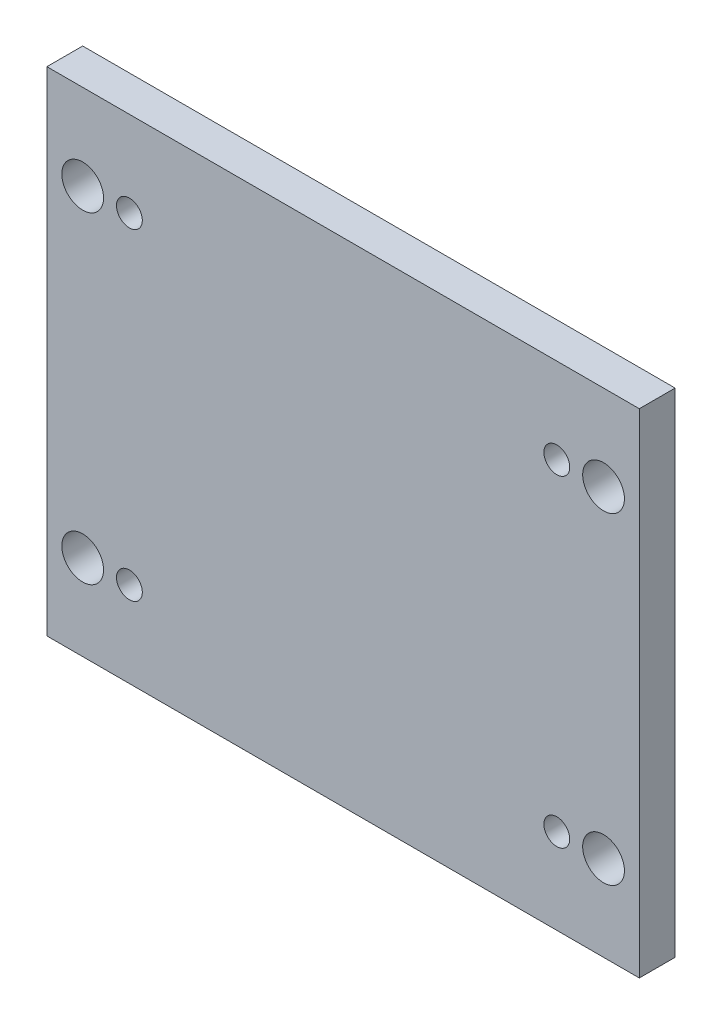
ISO-10303-21;
HEADER;
FILE_DESCRIPTION(('STEP AP214'),'2;1');
FILE_NAME('part.step','',(''),(''),'','','');
FILE_SCHEMA(('AUTOMOTIVE_DESIGN { 1 0 10303 214 1 1 1 1 }'));
ENDSEC;
DATA;
#1=APPLICATION_CONTEXT('core data for automotive mechanical design processes');
#2=APPLICATION_PROTOCOL_DEFINITION('international standard','automotive_design',2000,#1);
#3=PRODUCT_CONTEXT('',#1,'mechanical');
#4=PRODUCT('Part','Part','',(#3));
#5=PRODUCT_RELATED_PRODUCT_CATEGORY('part','',(#4));
#6=PRODUCT_DEFINITION_FORMATION('','',#4);
#7=PRODUCT_DEFINITION_CONTEXT('part definition',#1,'design');
#8=PRODUCT_DEFINITION('design','',#6,#7);
#9=PRODUCT_DEFINITION_SHAPE('','',#8);
#10=(LENGTH_UNIT() NAMED_UNIT(*) SI_UNIT(.MILLI.,.METRE.));
#11=(NAMED_UNIT(*) PLANE_ANGLE_UNIT() SI_UNIT($,.RADIAN.));
#12=(NAMED_UNIT(*) SI_UNIT($,.STERADIAN.) SOLID_ANGLE_UNIT());
#13=UNCERTAINTY_MEASURE_WITH_UNIT(LENGTH_MEASURE(1.E-05),#10,'distance_accuracy_value','');
#14=(GEOMETRIC_REPRESENTATION_CONTEXT(3) GLOBAL_UNCERTAINTY_ASSIGNED_CONTEXT((#13)) GLOBAL_UNIT_ASSIGNED_CONTEXT((#10,
#11,#12)) REPRESENTATION_CONTEXT('',''));
#15=CARTESIAN_POINT('',(0.,0.,0.));
#16=DIRECTION('',(0.,0.,1.));
#17=DIRECTION('',(1.,0.,0.));
#18=AXIS2_PLACEMENT_3D('',#15,#16,#17);
#19=CARTESIAN_POINT('',(0.,0.,36.));
#20=DIRECTION('',(0.,0.,1.));
#21=DIRECTION('',(1.,0.,0.));
#22=AXIS2_PLACEMENT_3D('',#19,#20,#21);
#23=PLANE('',#22);
#24=CARTESIAN_POINT('',(-215.,-162.,36.));
#25=DIRECTION('',(0.,0.,-1.));
#26=DIRECTION('',(-1.,0.,0.));
#27=AXIS2_PLACEMENT_3D('',#24,#25,#26);
#28=CIRCLE('',#27,13.);
#29=CARTESIAN_POINT('',(-228.,-162.,36.));
#30=VERTEX_POINT('',#29);
#31=EDGE_CURVE('E173',#30,#30,#28,.T.);
#32=ORIENTED_EDGE('',*,*,#31,.T.);
#33=EDGE_LOOP('',(#32));
#34=FACE_BOUND('',#33,.T.);
#35=CARTESIAN_POINT('',(215.,162.,36.));
#36=DIRECTION('',(0.,0.,1.));
#37=DIRECTION('',(1.,0.,0.));
#38=AXIS2_PLACEMENT_3D('',#35,#36,#37);
#39=CIRCLE('',#38,13.);
#40=CARTESIAN_POINT('',(228.,162.,36.));
#41=VERTEX_POINT('',#40);
#42=EDGE_CURVE('E152',#41,#41,#39,.T.);
#43=ORIENTED_EDGE('',*,*,#42,.F.);
#44=EDGE_LOOP('',(#43));
#45=FACE_BOUND('',#44,.T.);
#46=CARTESIAN_POINT('',(-262.,162.,36.));
#47=DIRECTION('',(0.,0.,1.));
#48=DIRECTION('',(1.,0.,0.));
#49=AXIS2_PLACEMENT_3D('',#46,#47,#48);
#50=CIRCLE('',#49,21.);
#51=CARTESIAN_POINT('',(-241.,162.,36.));
#52=VERTEX_POINT('',#51);
#53=EDGE_CURVE('E132',#52,#52,#50,.T.);
#54=ORIENTED_EDGE('',*,*,#53,.F.);
#55=EDGE_LOOP('',(#54));
#56=FACE_BOUND('',#55,.T.);
#57=CARTESIAN_POINT('',(-262.,-162.,36.));
#58=DIRECTION('',(0.,0.,1.));
#59=DIRECTION('',(1.,0.,0.));
#60=AXIS2_PLACEMENT_3D('',#57,#58,#59);
#61=CIRCLE('',#60,21.);
#62=CARTESIAN_POINT('',(-241.,-162.,36.));
#63=VERTEX_POINT('',#62);
#64=EDGE_CURVE('E126',#63,#63,#61,.T.);
#65=ORIENTED_EDGE('',*,*,#64,.F.);
#66=EDGE_LOOP('',(#65));
#67=FACE_BOUND('',#66,.T.);
#68=CARTESIAN_POINT('',(262.,-162.,36.));
#69=DIRECTION('',(0.,0.,1.));
#70=DIRECTION('',(1.,0.,0.));
#71=AXIS2_PLACEMENT_3D('',#68,#69,#70);
#72=CIRCLE('',#71,21.);
#73=CARTESIAN_POINT('',(283.,-162.,36.));
#74=VERTEX_POINT('',#73);
#75=EDGE_CURVE('E120',#74,#74,#72,.T.);
#76=ORIENTED_EDGE('',*,*,#75,.F.);
#77=EDGE_LOOP('',(#76));
#78=FACE_BOUND('',#77,.T.);
#79=CARTESIAN_POINT('',(262.,162.,36.));
#80=DIRECTION('',(0.,0.,1.));
#81=DIRECTION('',(1.,0.,0.));
#82=AXIS2_PLACEMENT_3D('',#79,#80,#81);
#83=CIRCLE('',#82,21.);
#84=CARTESIAN_POINT('',(283.,162.,36.));
#85=VERTEX_POINT('',#84);
#86=EDGE_CURVE('E114',#85,#85,#83,.T.);
#87=ORIENTED_EDGE('',*,*,#86,.F.);
#88=EDGE_LOOP('',(#87));
#89=FACE_BOUND('',#88,.T.);
#90=DIRECTION('',(0.,-1.,0.));
#91=VECTOR('',#90,1.);
#92=CARTESIAN_POINT('',(-298.,248.,36.));
#93=LINE('',#92,#91);
#94=CARTESIAN_POINT('',(-298.,248.,36.));
#95=VERTEX_POINT('',#94);
#96=CARTESIAN_POINT('',(-298.,-248.,36.));
#97=VERTEX_POINT('',#96);
#98=EDGE_CURVE('E87',#95,#97,#93,.T.);
#99=ORIENTED_EDGE('',*,*,#98,.T.);
#100=DIRECTION('',(1.,0.,0.));
#101=VECTOR('',#100,1.);
#102=CARTESIAN_POINT('',(-298.,-248.,36.));
#103=LINE('',#102,#101);
#104=CARTESIAN_POINT('',(298.,-248.,36.));
#105=VERTEX_POINT('',#104);
#106=EDGE_CURVE('E82',#97,#105,#103,.T.);
#107=ORIENTED_EDGE('',*,*,#106,.T.);
#108=DIRECTION('',(0.,1.,0.));
#109=VECTOR('',#108,1.);
#110=CARTESIAN_POINT('',(298.,-248.,36.));
#111=LINE('',#110,#109);
#112=CARTESIAN_POINT('',(298.,248.,36.));
#113=VERTEX_POINT('',#112);
#114=EDGE_CURVE('E85',#105,#113,#111,.T.);
#115=ORIENTED_EDGE('',*,*,#114,.T.);
#116=DIRECTION('',(-1.,0.,0.));
#117=VECTOR('',#116,1.);
#118=CARTESIAN_POINT('',(298.,248.,36.));
#119=LINE('',#118,#117);
#120=EDGE_CURVE('E52',#113,#95,#119,.T.);
#121=ORIENTED_EDGE('',*,*,#120,.T.);
#122=EDGE_LOOP('',(#99,#107,#115,#121));
#123=FACE_BOUND('',#122,.T.);
#124=CARTESIAN_POINT('',(215.,-162.,36.));
#125=DIRECTION('',(0.,0.,-1.));
#126=DIRECTION('',(-1.,0.,0.));
#127=AXIS2_PLACEMENT_3D('',#124,#125,#126);
#128=CIRCLE('',#127,13.);
#129=CARTESIAN_POINT('',(202.,-162.,36.));
#130=VERTEX_POINT('',#129);
#131=EDGE_CURVE('E164',#130,#130,#128,.T.);
#132=ORIENTED_EDGE('',*,*,#131,.T.);
#133=EDGE_LOOP('',(#132));
#134=FACE_BOUND('',#133,.T.);
#135=CARTESIAN_POINT('',(-215.,162.,36.));
#136=DIRECTION('',(0.,0.,1.));
#137=DIRECTION('',(1.,0.,0.));
#138=AXIS2_PLACEMENT_3D('',#135,#136,#137);
#139=CIRCLE('',#138,13.);
#140=CARTESIAN_POINT('',(-202.,162.,36.));
#141=VERTEX_POINT('',#140);
#142=EDGE_CURVE('E179',#141,#141,#139,.T.);
#143=ORIENTED_EDGE('',*,*,#142,.F.);
#144=EDGE_LOOP('',(#143));
#145=FACE_BOUND('',#144,.T.);
#146=ADVANCED_FACE('F35',(#34,#45,#56,#67,#78,#89,#123,#134,#145),#23,.T.);
#147=CARTESIAN_POINT('',(0.,0.,0.));
#148=DIRECTION('',(0.,0.,1.));
#149=DIRECTION('',(1.,0.,0.));
#150=AXIS2_PLACEMENT_3D('',#147,#148,#149);
#151=PLANE('',#150);
#152=CARTESIAN_POINT('',(-215.,162.,0.));
#153=DIRECTION('',(0.,0.,1.));
#154=DIRECTION('',(1.,0.,0.));
#155=AXIS2_PLACEMENT_3D('',#152,#153,#154);
#156=CIRCLE('',#155,9.00000000000001);
#157=CARTESIAN_POINT('',(-206.,162.,0.));
#158=VERTEX_POINT('',#157);
#159=EDGE_CURVE('E143',#158,#158,#156,.T.);
#160=ORIENTED_EDGE('',*,*,#159,.T.);
#161=EDGE_LOOP('',(#160));
#162=FACE_BOUND('',#161,.T.);
#163=CARTESIAN_POINT('',(215.,162.,0.));
#164=DIRECTION('',(0.,0.,1.));
#165=DIRECTION('',(1.,0.,0.));
#166=AXIS2_PLACEMENT_3D('',#163,#164,#165);
#167=CIRCLE('',#166,9.00000000000001);
#168=CARTESIAN_POINT('',(224.,162.,0.));
#169=VERTEX_POINT('',#168);
#170=EDGE_CURVE('E135',#169,#169,#167,.T.);
#171=ORIENTED_EDGE('',*,*,#170,.T.);
#172=EDGE_LOOP('',(#171));
#173=FACE_BOUND('',#172,.T.);
#174=CARTESIAN_POINT('',(-262.,162.,0.));
#175=DIRECTION('',(0.,0.,1.));
#176=DIRECTION('',(1.,0.,0.));
#177=AXIS2_PLACEMENT_3D('',#174,#175,#176);
#178=CIRCLE('',#177,21.);
#179=CARTESIAN_POINT('',(-241.,162.,0.));
#180=VERTEX_POINT('',#179);
#181=EDGE_CURVE('E129',#180,#180,#178,.T.);
#182=ORIENTED_EDGE('',*,*,#181,.T.);
#183=EDGE_LOOP('',(#182));
#184=FACE_BOUND('',#183,.T.);
#185=CARTESIAN_POINT('',(-262.,-162.,0.));
#186=DIRECTION('',(0.,0.,1.));
#187=DIRECTION('',(1.,0.,0.));
#188=AXIS2_PLACEMENT_3D('',#185,#186,#187);
#189=CIRCLE('',#188,21.);
#190=CARTESIAN_POINT('',(-241.,-162.,0.));
#191=VERTEX_POINT('',#190);
#192=EDGE_CURVE('E123',#191,#191,#189,.T.);
#193=ORIENTED_EDGE('',*,*,#192,.T.);
#194=EDGE_LOOP('',(#193));
#195=FACE_BOUND('',#194,.T.);
#196=CARTESIAN_POINT('',(262.,-162.,0.));
#197=DIRECTION('',(0.,0.,1.));
#198=DIRECTION('',(1.,0.,0.));
#199=AXIS2_PLACEMENT_3D('',#196,#197,#198);
#200=CIRCLE('',#199,21.);
#201=CARTESIAN_POINT('',(283.,-162.,0.));
#202=VERTEX_POINT('',#201);
#203=EDGE_CURVE('E117',#202,#202,#200,.T.);
#204=ORIENTED_EDGE('',*,*,#203,.T.);
#205=EDGE_LOOP('',(#204));
#206=FACE_BOUND('',#205,.T.);
#207=CARTESIAN_POINT('',(262.,162.,0.));
#208=DIRECTION('',(0.,0.,1.));
#209=DIRECTION('',(1.,0.,0.));
#210=AXIS2_PLACEMENT_3D('',#207,#208,#209);
#211=CIRCLE('',#210,21.);
#212=CARTESIAN_POINT('',(283.,162.,0.));
#213=VERTEX_POINT('',#212);
#214=EDGE_CURVE('E102',#213,#213,#211,.T.);
#215=ORIENTED_EDGE('',*,*,#214,.T.);
#216=EDGE_LOOP('',(#215));
#217=FACE_BOUND('',#216,.T.);
#218=DIRECTION('',(0.,-1.,0.));
#219=VECTOR('',#218,1.);
#220=CARTESIAN_POINT('',(-298.,248.,0.));
#221=LINE('',#220,#219);
#222=CARTESIAN_POINT('',(-298.,248.,0.));
#223=VERTEX_POINT('',#222);
#224=CARTESIAN_POINT('',(-298.,-248.,0.));
#225=VERTEX_POINT('',#224);
#226=EDGE_CURVE('E99',#223,#225,#221,.T.);
#227=ORIENTED_EDGE('',*,*,#226,.F.);
#228=DIRECTION('',(-1.,0.,0.));
#229=VECTOR('',#228,1.);
#230=CARTESIAN_POINT('',(298.,248.,0.));
#231=LINE('',#230,#229);
#232=CARTESIAN_POINT('',(298.,248.,0.));
#233=VERTEX_POINT('',#232);
#234=EDGE_CURVE('E75',#233,#223,#231,.T.);
#235=ORIENTED_EDGE('',*,*,#234,.F.);
#236=DIRECTION('',(0.,1.,0.));
#237=VECTOR('',#236,1.);
#238=CARTESIAN_POINT('',(298.,-248.,0.));
#239=LINE('',#238,#237);
#240=CARTESIAN_POINT('',(298.,-248.,0.));
#241=VERTEX_POINT('',#240);
#242=EDGE_CURVE('E69',#241,#233,#239,.T.);
#243=ORIENTED_EDGE('',*,*,#242,.F.);
#244=DIRECTION('',(1.,0.,0.));
#245=VECTOR('',#244,1.);
#246=CARTESIAN_POINT('',(-298.,-248.,0.));
#247=LINE('',#246,#245);
#248=EDGE_CURVE('E91',#225,#241,#247,.T.);
#249=ORIENTED_EDGE('',*,*,#248,.F.);
#250=EDGE_LOOP('',(#227,#235,#243,#249));
#251=FACE_BOUND('',#250,.T.);
#252=CARTESIAN_POINT('',(215.,-162.,0.));
#253=DIRECTION('',(0.,0.,-1.));
#254=DIRECTION('',(-1.,0.,0.));
#255=AXIS2_PLACEMENT_3D('',#252,#253,#254);
#256=CIRCLE('',#255,9.00000000000001);
#257=CARTESIAN_POINT('',(206.,-162.,0.));
#258=VERTEX_POINT('',#257);
#259=EDGE_CURVE('E140',#258,#258,#256,.T.);
#260=ORIENTED_EDGE('',*,*,#259,.F.);
#261=EDGE_LOOP('',(#260));
#262=FACE_BOUND('',#261,.T.);
#263=CARTESIAN_POINT('',(-215.,-162.,0.));
#264=DIRECTION('',(0.,0.,-1.));
#265=DIRECTION('',(-1.,0.,0.));
#266=AXIS2_PLACEMENT_3D('',#263,#264,#265);
#267=CIRCLE('',#266,9.00000000000001);
#268=CARTESIAN_POINT('',(-224.,-162.,0.));
#269=VERTEX_POINT('',#268);
#270=EDGE_CURVE('E146',#269,#269,#267,.T.);
#271=ORIENTED_EDGE('',*,*,#270,.F.);
#272=EDGE_LOOP('',(#271));
#273=FACE_BOUND('',#272,.T.);
#274=ADVANCED_FACE('F110',(#162,#173,#184,#195,#206,#217,#251,#262,#273),#151,.F.);
#275=CARTESIAN_POINT('',(-298.,248.,36.));
#276=DIRECTION('',(1.,0.,0.));
#277=DIRECTION('',(0.,0.,-1.));
#278=AXIS2_PLACEMENT_3D('',#275,#276,#277);
#279=PLANE('',#278);
#280=ORIENTED_EDGE('',*,*,#226,.T.);
#281=DIRECTION('',(0.,0.,-1.));
#282=VECTOR('',#281,1.);
#283=CARTESIAN_POINT('',(-298.,-248.,36.));
#284=LINE('',#283,#282);
#285=EDGE_CURVE('E11',#97,#225,#284,.T.);
#286=ORIENTED_EDGE('',*,*,#285,.F.);
#287=ORIENTED_EDGE('',*,*,#98,.F.);
#288=DIRECTION('',(0.,0.,-1.));
#289=VECTOR('',#288,1.);
#290=CARTESIAN_POINT('',(-298.,248.,36.));
#291=LINE('',#290,#289);
#292=EDGE_CURVE('E95',#95,#223,#291,.T.);
#293=ORIENTED_EDGE('',*,*,#292,.T.);
#294=EDGE_LOOP('',(#280,#286,#287,#293));
#295=FACE_BOUND('',#294,.T.);
#296=ADVANCED_FACE('F37',(#295),#279,.F.);
#297=CARTESIAN_POINT('',(-298.,-248.,36.));
#298=DIRECTION('',(0.,1.,0.));
#299=DIRECTION('',(0.,0.,1.));
#300=AXIS2_PLACEMENT_3D('',#297,#298,#299);
#301=PLANE('',#300);
#302=ORIENTED_EDGE('',*,*,#248,.T.);
#303=DIRECTION('',(0.,0.,-1.));
#304=VECTOR('',#303,1.);
#305=CARTESIAN_POINT('',(298.,-248.,36.));
#306=LINE('',#305,#304);
#307=EDGE_CURVE('E44',#105,#241,#306,.T.);
#308=ORIENTED_EDGE('',*,*,#307,.F.);
#309=ORIENTED_EDGE('',*,*,#106,.F.);
#310=ORIENTED_EDGE('',*,*,#285,.T.);
#311=EDGE_LOOP('',(#302,#308,#309,#310));
#312=FACE_BOUND('',#311,.T.);
#313=ADVANCED_FACE('F90',(#312),#301,.F.);
#314=CARTESIAN_POINT('',(298.,-248.,36.));
#315=DIRECTION('',(-1.,0.,0.));
#316=DIRECTION('',(0.,0.,1.));
#317=AXIS2_PLACEMENT_3D('',#314,#315,#316);
#318=PLANE('',#317);
#319=ORIENTED_EDGE('',*,*,#242,.T.);
#320=DIRECTION('',(0.,0.,-1.));
#321=VECTOR('',#320,1.);
#322=CARTESIAN_POINT('',(298.,248.,36.));
#323=LINE('',#322,#321);
#324=EDGE_CURVE('E92',#113,#233,#323,.T.);
#325=ORIENTED_EDGE('',*,*,#324,.F.);
#326=ORIENTED_EDGE('',*,*,#114,.F.);
#327=ORIENTED_EDGE('',*,*,#307,.T.);
#328=EDGE_LOOP('',(#319,#325,#326,#327));
#329=FACE_BOUND('',#328,.T.);
#330=ADVANCED_FACE('F93',(#329),#318,.F.);
#331=CARTESIAN_POINT('',(298.,248.,36.));
#332=DIRECTION('',(0.,-1.,0.));
#333=DIRECTION('',(0.,0.,-1.));
#334=AXIS2_PLACEMENT_3D('',#331,#332,#333);
#335=PLANE('',#334);
#336=ORIENTED_EDGE('',*,*,#234,.T.);
#337=ORIENTED_EDGE('',*,*,#292,.F.);
#338=ORIENTED_EDGE('',*,*,#120,.F.);
#339=ORIENTED_EDGE('',*,*,#324,.T.);
#340=EDGE_LOOP('',(#336,#337,#338,#339));
#341=FACE_BOUND('',#340,.T.);
#342=ADVANCED_FACE('F107',(#341),#335,.F.);
#343=CARTESIAN_POINT('',(262.,162.,0.));
#344=DIRECTION('',(0.,0.,1.));
#345=DIRECTION('',(1.,0.,0.));
#346=AXIS2_PLACEMENT_3D('',#343,#344,#345);
#347=CYLINDRICAL_SURFACE('',#346,21.);
#348=ORIENTED_EDGE('',*,*,#214,.F.);
#349=EDGE_LOOP('',(#348));
#350=FACE_BOUND('',#349,.T.);
#351=ORIENTED_EDGE('',*,*,#86,.T.);
#352=EDGE_LOOP('',(#351));
#353=FACE_BOUND('',#352,.T.);
#354=ADVANCED_FACE('F212',(#350,#353),#347,.F.);
#355=CARTESIAN_POINT('',(262.,-162.,0.));
#356=DIRECTION('',(0.,0.,1.));
#357=DIRECTION('',(1.,0.,0.));
#358=AXIS2_PLACEMENT_3D('',#355,#356,#357);
#359=CYLINDRICAL_SURFACE('',#358,21.);
#360=ORIENTED_EDGE('',*,*,#203,.F.);
#361=EDGE_LOOP('',(#360));
#362=FACE_BOUND('',#361,.T.);
#363=ORIENTED_EDGE('',*,*,#75,.T.);
#364=EDGE_LOOP('',(#363));
#365=FACE_BOUND('',#364,.T.);
#366=ADVANCED_FACE('F309',(#362,#365),#359,.F.);
#367=CARTESIAN_POINT('',(-262.,-162.,0.));
#368=DIRECTION('',(0.,0.,1.));
#369=DIRECTION('',(1.,0.,0.));
#370=AXIS2_PLACEMENT_3D('',#367,#368,#369);
#371=CYLINDRICAL_SURFACE('',#370,21.);
#372=ORIENTED_EDGE('',*,*,#192,.F.);
#373=EDGE_LOOP('',(#372));
#374=FACE_BOUND('',#373,.T.);
#375=ORIENTED_EDGE('',*,*,#64,.T.);
#376=EDGE_LOOP('',(#375));
#377=FACE_BOUND('',#376,.T.);
#378=ADVANCED_FACE('F319',(#374,#377),#371,.F.);
#379=CARTESIAN_POINT('',(-262.,162.,0.));
#380=DIRECTION('',(0.,0.,1.));
#381=DIRECTION('',(1.,0.,0.));
#382=AXIS2_PLACEMENT_3D('',#379,#380,#381);
#383=CYLINDRICAL_SURFACE('',#382,21.);
#384=ORIENTED_EDGE('',*,*,#181,.F.);
#385=EDGE_LOOP('',(#384));
#386=FACE_BOUND('',#385,.T.);
#387=ORIENTED_EDGE('',*,*,#53,.T.);
#388=EDGE_LOOP('',(#387));
#389=FACE_BOUND('',#388,.T.);
#390=ADVANCED_FACE('F328',(#386,#389),#383,.F.);
#391=CARTESIAN_POINT('',(215.,162.,0.));
#392=DIRECTION('',(0.,0.,1.));
#393=DIRECTION('',(1.,0.,0.));
#394=AXIS2_PLACEMENT_3D('',#391,#392,#393);
#395=CYLINDRICAL_SURFACE('',#394,9.00000000000001);
#396=CARTESIAN_POINT('',(215.,162.,15.));
#397=DIRECTION('',(0.,0.,1.));
#398=DIRECTION('',(1.,0.,0.));
#399=AXIS2_PLACEMENT_3D('',#396,#397,#398);
#400=CIRCLE('',#399,9.00000000000001);
#401=CARTESIAN_POINT('',(224.,162.,15.));
#402=VERTEX_POINT('',#401);
#403=EDGE_CURVE('E149',#402,#402,#400,.T.);
#404=ORIENTED_EDGE('',*,*,#403,.T.);
#405=EDGE_LOOP('',(#404));
#406=FACE_BOUND('',#405,.T.);
#407=ORIENTED_EDGE('',*,*,#170,.F.);
#408=EDGE_LOOP('',(#407));
#409=FACE_BOUND('',#408,.T.);
#410=ADVANCED_FACE('F338',(#406,#409),#395,.F.);
#411=CARTESIAN_POINT('',(215.,-162.,15.));
#412=DIRECTION('',(0.,0.,-1.));
#413=DIRECTION('',(-1.,0.,0.));
#414=AXIS2_PLACEMENT_3D('',#411,#412,#413);
#415=CYLINDRICAL_SURFACE('',#414,9.00000000000001);
#416=ORIENTED_EDGE('',*,*,#259,.T.);
#417=EDGE_LOOP('',(#416));
#418=FACE_BOUND('',#417,.T.);
#419=CARTESIAN_POINT('',(215.,-162.,15.));
#420=DIRECTION('',(0.,0.,1.));
#421=DIRECTION('',(1.,0.,0.));
#422=AXIS2_PLACEMENT_3D('',#419,#420,#421);
#423=CIRCLE('',#422,9.00000000000001);
#424=CARTESIAN_POINT('',(224.,-162.,15.));
#425=VERTEX_POINT('',#424);
#426=EDGE_CURVE('E158',#425,#425,#423,.T.);
#427=ORIENTED_EDGE('',*,*,#426,.T.);
#428=EDGE_LOOP('',(#427));
#429=FACE_BOUND('',#428,.T.);
#430=ADVANCED_FACE('F348',(#418,#429),#415,.F.);
#431=CARTESIAN_POINT('',(-215.,162.,0.));
#432=DIRECTION('',(0.,0.,1.));
#433=DIRECTION('',(1.,0.,0.));
#434=AXIS2_PLACEMENT_3D('',#431,#432,#433);
#435=CYLINDRICAL_SURFACE('',#434,9.00000000000001);
#436=CARTESIAN_POINT('',(-215.,162.,15.));
#437=DIRECTION('',(0.,0.,1.));
#438=DIRECTION('',(1.,0.,0.));
#439=AXIS2_PLACEMENT_3D('',#436,#437,#438);
#440=CIRCLE('',#439,9.00000000000001);
#441=CARTESIAN_POINT('',(-206.,162.,15.));
#442=VERTEX_POINT('',#441);
#443=EDGE_CURVE('E176',#442,#442,#440,.T.);
#444=ORIENTED_EDGE('',*,*,#443,.T.);
#445=EDGE_LOOP('',(#444));
#446=FACE_BOUND('',#445,.T.);
#447=ORIENTED_EDGE('',*,*,#159,.F.);
#448=EDGE_LOOP('',(#447));
#449=FACE_BOUND('',#448,.T.);
#450=ADVANCED_FACE('F237',(#446,#449),#435,.F.);
#451=CARTESIAN_POINT('',(-215.,-162.,15.));
#452=DIRECTION('',(0.,0.,-1.));
#453=DIRECTION('',(-1.,0.,0.));
#454=AXIS2_PLACEMENT_3D('',#451,#452,#453);
#455=CYLINDRICAL_SURFACE('',#454,9.00000000000001);
#456=ORIENTED_EDGE('',*,*,#270,.T.);
#457=EDGE_LOOP('',(#456));
#458=FACE_BOUND('',#457,.T.);
#459=CARTESIAN_POINT('',(-215.,-162.,15.));
#460=DIRECTION('',(0.,0.,1.));
#461=DIRECTION('',(1.,0.,0.));
#462=AXIS2_PLACEMENT_3D('',#459,#460,#461);
#463=CIRCLE('',#462,9.00000000000001);
#464=CARTESIAN_POINT('',(-206.,-162.,15.));
#465=VERTEX_POINT('',#464);
#466=EDGE_CURVE('E167',#465,#465,#463,.T.);
#467=ORIENTED_EDGE('',*,*,#466,.T.);
#468=EDGE_LOOP('',(#467));
#469=FACE_BOUND('',#468,.T.);
#470=ADVANCED_FACE('F240',(#458,#469),#455,.F.);
#471=CARTESIAN_POINT('',(215.,162.,15.));
#472=DIRECTION('',(0.,0.,1.));
#473=DIRECTION('',(1.,0.,0.));
#474=AXIS2_PLACEMENT_3D('',#471,#472,#473);
#475=CYLINDRICAL_SURFACE('',#474,13.);
#476=ORIENTED_EDGE('',*,*,#42,.T.);
#477=EDGE_LOOP('',(#476));
#478=FACE_BOUND('',#477,.T.);
#479=CARTESIAN_POINT('',(215.,162.,15.));
#480=DIRECTION('',(0.,0.,1.));
#481=DIRECTION('',(1.,0.,0.));
#482=AXIS2_PLACEMENT_3D('',#479,#480,#481);
#483=CIRCLE('',#482,13.);
#484=CARTESIAN_POINT('',(228.,162.,15.));
#485=VERTEX_POINT('',#484);
#486=EDGE_CURVE('E155',#485,#485,#483,.T.);
#487=ORIENTED_EDGE('',*,*,#486,.F.);
#488=EDGE_LOOP('',(#487));
#489=FACE_BOUND('',#488,.T.);
#490=ADVANCED_FACE('F243',(#478,#489),#475,.F.);
#491=CARTESIAN_POINT('',(215.,175.,15.));
#492=DIRECTION('',(0.,0.,1.));
#493=DIRECTION('',(1.,0.,0.));
#494=AXIS2_PLACEMENT_3D('',#491,#492,#493);
#495=PLANE('',#494);
#496=ORIENTED_EDGE('',*,*,#403,.F.);
#497=EDGE_LOOP('',(#496));
#498=FACE_BOUND('',#497,.T.);
#499=ORIENTED_EDGE('',*,*,#486,.T.);
#500=EDGE_LOOP('',(#499));
#501=FACE_BOUND('',#500,.T.);
#502=ADVANCED_FACE('F255',(#498,#501),#495,.T.);
#503=CARTESIAN_POINT('',(215.,-162.,15.));
#504=DIRECTION('',(0.,0.,1.));
#505=DIRECTION('',(1.,0.,0.));
#506=AXIS2_PLACEMENT_3D('',#503,#504,#505);
#507=PLANE('',#506);
#508=ORIENTED_EDGE('',*,*,#426,.F.);
#509=EDGE_LOOP('',(#508));
#510=FACE_BOUND('',#509,.T.);
#511=CARTESIAN_POINT('',(215.,-162.,15.));
#512=DIRECTION('',(0.,0.,-1.));
#513=DIRECTION('',(-1.,0.,0.));
#514=AXIS2_PLACEMENT_3D('',#511,#512,#513);
#515=CIRCLE('',#514,13.);
#516=CARTESIAN_POINT('',(202.,-162.,15.));
#517=VERTEX_POINT('',#516);
#518=EDGE_CURVE('E161',#517,#517,#515,.T.);
#519=ORIENTED_EDGE('',*,*,#518,.F.);
#520=EDGE_LOOP('',(#519));
#521=FACE_BOUND('',#520,.T.);
#522=ADVANCED_FACE('F262',(#510,#521),#507,.T.);
#523=CARTESIAN_POINT('',(215.,-162.,36.));
#524=DIRECTION('',(0.,0.,-1.));
#525=DIRECTION('',(-1.,0.,0.));
#526=AXIS2_PLACEMENT_3D('',#523,#524,#525);
#527=CYLINDRICAL_SURFACE('',#526,13.);
#528=ORIENTED_EDGE('',*,*,#518,.T.);
#529=EDGE_LOOP('',(#528));
#530=FACE_BOUND('',#529,.T.);
#531=ORIENTED_EDGE('',*,*,#131,.F.);
#532=EDGE_LOOP('',(#531));
#533=FACE_BOUND('',#532,.T.);
#534=ADVANCED_FACE('F271',(#530,#533),#527,.F.);
#535=CARTESIAN_POINT('',(-215.,-162.,15.));
#536=DIRECTION('',(0.,0.,1.));
#537=DIRECTION('',(1.,0.,0.));
#538=AXIS2_PLACEMENT_3D('',#535,#536,#537);
#539=PLANE('',#538);
#540=ORIENTED_EDGE('',*,*,#466,.F.);
#541=EDGE_LOOP('',(#540));
#542=FACE_BOUND('',#541,.T.);
#543=CARTESIAN_POINT('',(-215.,-162.,15.));
#544=DIRECTION('',(0.,0.,-1.));
#545=DIRECTION('',(-1.,0.,0.));
#546=AXIS2_PLACEMENT_3D('',#543,#544,#545);
#547=CIRCLE('',#546,13.);
#548=CARTESIAN_POINT('',(-228.,-162.,15.));
#549=VERTEX_POINT('',#548);
#550=EDGE_CURVE('E170',#549,#549,#547,.T.);
#551=ORIENTED_EDGE('',*,*,#550,.F.);
#552=EDGE_LOOP('',(#551));
#553=FACE_BOUND('',#552,.T.);
#554=ADVANCED_FACE('F199',(#542,#553),#539,.T.);
#555=CARTESIAN_POINT('',(-215.,-162.,36.));
#556=DIRECTION('',(0.,0.,-1.));
#557=DIRECTION('',(-1.,0.,0.));
#558=AXIS2_PLACEMENT_3D('',#555,#556,#557);
#559=CYLINDRICAL_SURFACE('',#558,13.);
#560=ORIENTED_EDGE('',*,*,#550,.T.);
#561=EDGE_LOOP('',(#560));
#562=FACE_BOUND('',#561,.T.);
#563=ORIENTED_EDGE('',*,*,#31,.F.);
#564=EDGE_LOOP('',(#563));
#565=FACE_BOUND('',#564,.T.);
#566=ADVANCED_FACE('F190',(#562,#565),#559,.F.);
#567=CARTESIAN_POINT('',(-215.,162.,15.));
#568=DIRECTION('',(0.,0.,1.));
#569=DIRECTION('',(1.,0.,0.));
#570=AXIS2_PLACEMENT_3D('',#567,#568,#569);
#571=CYLINDRICAL_SURFACE('',#570,13.);
#572=ORIENTED_EDGE('',*,*,#142,.T.);
#573=EDGE_LOOP('',(#572));
#574=FACE_BOUND('',#573,.T.);
#575=CARTESIAN_POINT('',(-215.,162.,15.));
#576=DIRECTION('',(0.,0.,1.));
#577=DIRECTION('',(1.,0.,0.));
#578=AXIS2_PLACEMENT_3D('',#575,#576,#577);
#579=CIRCLE('',#578,13.);
#580=CARTESIAN_POINT('',(-202.,162.,15.));
#581=VERTEX_POINT('',#580);
#582=EDGE_CURVE('E182',#581,#581,#579,.T.);
#583=ORIENTED_EDGE('',*,*,#582,.F.);
#584=EDGE_LOOP('',(#583));
#585=FACE_BOUND('',#584,.T.);
#586=ADVANCED_FACE('F188',(#574,#585),#571,.F.);
#587=CARTESIAN_POINT('',(-215.,175.,15.));
#588=DIRECTION('',(0.,0.,1.));
#589=DIRECTION('',(1.,0.,0.));
#590=AXIS2_PLACEMENT_3D('',#587,#588,#589);
#591=PLANE('',#590);
#592=ORIENTED_EDGE('',*,*,#443,.F.);
#593=EDGE_LOOP('',(#592));
#594=FACE_BOUND('',#593,.T.);
#595=ORIENTED_EDGE('',*,*,#582,.T.);
#596=EDGE_LOOP('',(#595));
#597=FACE_BOUND('',#596,.T.);
#598=ADVANCED_FACE('F186',(#594,#597),#591,.T.);
#599=CLOSED_SHELL('',(#146,#274,#296,#313,#330,#342,#354,#366,#378,#390,#410,#430,#450,#470,
#490,#502,#522,#534,#554,#566,#586,#598));
#600=MANIFOLD_SOLID_BREP('B2',#599);
#601=ADVANCED_BREP_SHAPE_REPRESENTATION('',(#18,#600),#14);
#602=SHAPE_DEFINITION_REPRESENTATION(#9,#601);
ENDSEC;
END-ISO-10303-21;
